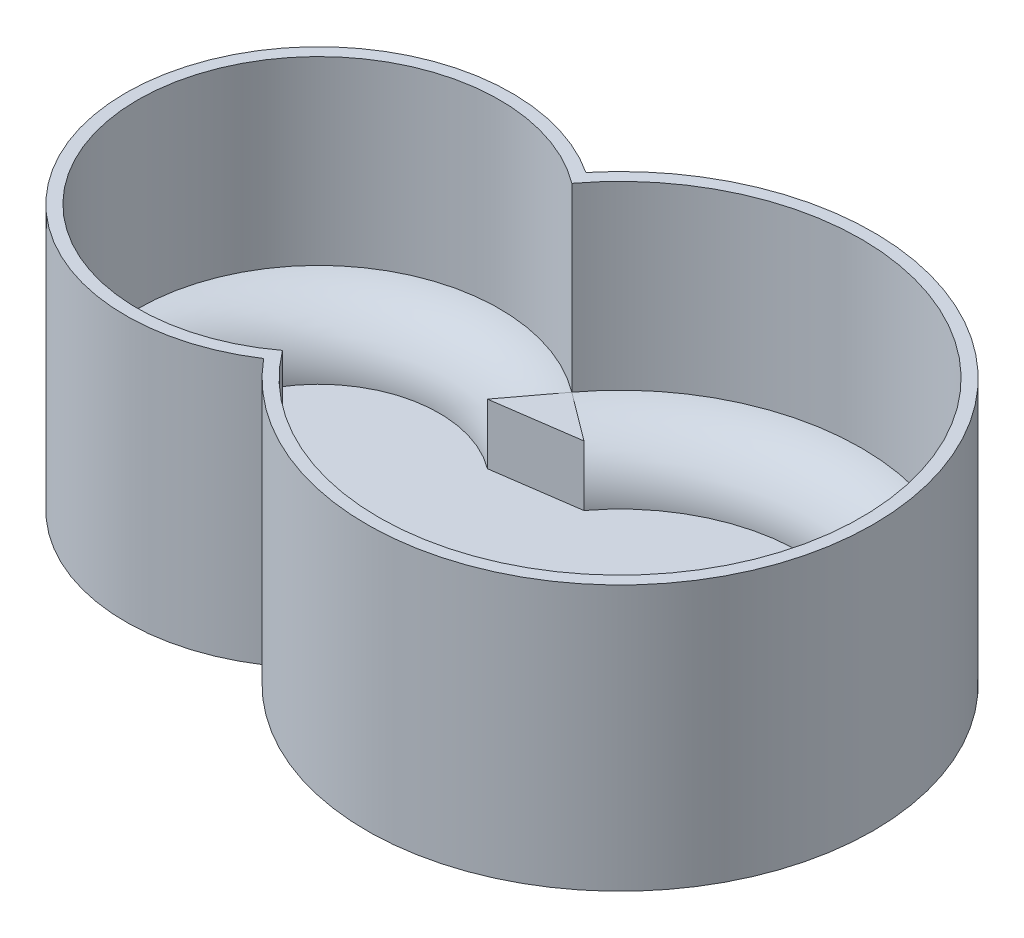
ISO-10303-21;
HEADER;
FILE_DESCRIPTION(('STEP AP214'),'2;1');
FILE_NAME('part.step','',(''),(''),'','','');
FILE_SCHEMA(('AUTOMOTIVE_DESIGN { 1 0 10303 214 1 1 1 1 }'));
ENDSEC;
DATA;
#1=APPLICATION_CONTEXT('core data for automotive mechanical design processes');
#2=APPLICATION_PROTOCOL_DEFINITION('international standard','automotive_design',2000,#1);
#3=PRODUCT_CONTEXT('',#1,'mechanical');
#4=PRODUCT('Part','Part','',(#3));
#5=PRODUCT_RELATED_PRODUCT_CATEGORY('part','',(#4));
#6=PRODUCT_DEFINITION_FORMATION('','',#4);
#7=PRODUCT_DEFINITION_CONTEXT('part definition',#1,'design');
#8=PRODUCT_DEFINITION('design','',#6,#7);
#9=PRODUCT_DEFINITION_SHAPE('','',#8);
#10=(LENGTH_UNIT() NAMED_UNIT(*) SI_UNIT(.MILLI.,.METRE.));
#11=(NAMED_UNIT(*) PLANE_ANGLE_UNIT() SI_UNIT($,.RADIAN.));
#12=(NAMED_UNIT(*) SI_UNIT($,.STERADIAN.) SOLID_ANGLE_UNIT());
#13=UNCERTAINTY_MEASURE_WITH_UNIT(LENGTH_MEASURE(1.E-05),#10,'distance_accuracy_value','');
#14=(GEOMETRIC_REPRESENTATION_CONTEXT(3) GLOBAL_UNCERTAINTY_ASSIGNED_CONTEXT((#13)) GLOBAL_UNIT_ASSIGNED_CONTEXT((#10,
#11,#12)) REPRESENTATION_CONTEXT('',''));
#15=CARTESIAN_POINT('',(0.,0.,0.));
#16=DIRECTION('',(0.,0.,1.));
#17=DIRECTION('',(1.,0.,0.));
#18=AXIS2_PLACEMENT_3D('',#15,#16,#17);
#19=CARTESIAN_POINT('',(-15.3320194768818,0.,-14.6396240059806));
#20=DIRECTION('',(0.,1.,0.));
#21=DIRECTION('',(0.,0.,1.));
#22=AXIS2_PLACEMENT_3D('',#19,#20,#21);
#23=PLANE('',#22);
#24=CARTESIAN_POINT('',(9.66798052311817,0.,-14.6396240059806));
#25=DIRECTION('',(0.,-1.,0.));
#26=DIRECTION('',(-0.8,0.,-0.6));
#27=AXIS2_PLACEMENT_3D('',#24,#25,#26);
#28=CIRCLE('',#27,15.);
#29=CARTESIAN_POINT('',(-2.33201947688185,0.,-23.6396240059806));
#30=VERTEX_POINT('',#29);
#31=CARTESIAN_POINT('',(-2.33201947688184,0.,-5.63962400598055));
#32=VERTEX_POINT('',#31);
#33=EDGE_CURVE('E165',#30,#32,#28,.T.);
#34=ORIENTED_EDGE('',*,*,#33,.F.);
#35=DIRECTION('',(0.989949493661166,0.,-0.141421356237311));
#36=VECTOR('',#35,1.);
#37=CARTESIAN_POINT('',(-2.33201947688185,0.,-23.6396240059806));
#38=LINE('',#37,#36);
#39=CARTESIAN_POINT('',(-9.33201947688184,0.,-22.6396240059806));
#40=VERTEX_POINT('',#39);
#41=EDGE_CURVE('E142',#40,#30,#38,.T.);
#42=ORIENTED_EDGE('',*,*,#41,.F.);
#43=CARTESIAN_POINT('',(-15.3320194768818,0.,-14.6396240059806));
#44=DIRECTION('',(0.,-1.,0.));
#45=DIRECTION('',(0.599999999999999,0.,0.800000000000001));
#46=AXIS2_PLACEMENT_3D('',#43,#44,#45);
#47=CIRCLE('',#46,10.);
#48=CARTESIAN_POINT('',(-9.33201947688185,0.,-6.63962400598055));
#49=VERTEX_POINT('',#48);
#50=EDGE_CURVE('E159',#49,#40,#47,.T.);
#51=ORIENTED_EDGE('',*,*,#50,.F.);
#52=DIRECTION('',(-0.989949493661166,0.,-0.14142135623731));
#53=VECTOR('',#52,1.);
#54=CARTESIAN_POINT('',(-9.33201947688185,0.,-6.63962400598055));
#55=LINE('',#54,#53);
#56=EDGE_CURVE('E133',#32,#49,#55,.T.);
#57=ORIENTED_EDGE('',*,*,#56,.F.);
#58=EDGE_LOOP('',(#34,#42,#51,#57));
#59=FACE_BOUND('',#58,.T.);
#60=ADVANCED_FACE('F45',(#59),#23,.T.);
#61=CARTESIAN_POINT('',(9.66798052311817,20.,-14.6396240059806));
#62=DIRECTION('',(0.,-1.,0.));
#63=DIRECTION('',(0.,0.,-1.));
#64=AXIS2_PLACEMENT_3D('',#61,#62,#63);
#65=CYLINDRICAL_SURFACE('',#64,20.);
#66=DIRECTION('',(0.,-1.,0.));
#67=VECTOR('',#66,1.);
#68=CARTESIAN_POINT('',(-6.33201947688185,20.,-26.6396240059806));
#69=LINE('',#68,#67);
#70=CARTESIAN_POINT('',(-6.33201947688185,20.,-26.6396240059806));
#71=VERTEX_POINT('',#70);
#72=CARTESIAN_POINT('',(-6.33201947688188,5.,-26.6396240059806));
#73=VERTEX_POINT('',#72);
#74=EDGE_CURVE('E12',#71,#73,#69,.T.);
#75=ORIENTED_EDGE('',*,*,#74,.T.);
#76=CARTESIAN_POINT('',(9.66798052311817,5.,-14.6396240059806));
#77=DIRECTION('',(0.,-1.,0.));
#78=DIRECTION('',(-0.8,0.,-0.6));
#79=AXIS2_PLACEMENT_3D('',#76,#77,#78);
#80=CIRCLE('',#79,20.0000000000001);
#81=CARTESIAN_POINT('',(-6.33201947688185,5.,-2.63962400598055));
#82=VERTEX_POINT('',#81);
#83=EDGE_CURVE('E170',#73,#82,#80,.T.);
#84=ORIENTED_EDGE('',*,*,#83,.T.);
#85=DIRECTION('',(0.,-1.,0.));
#86=VECTOR('',#85,1.);
#87=CARTESIAN_POINT('',(-6.33201947688185,20.,-2.63962400598055));
#88=LINE('',#87,#86);
#89=CARTESIAN_POINT('',(-6.33201947688185,20.,-2.63962400598055));
#90=VERTEX_POINT('',#89);
#91=EDGE_CURVE('E54',#90,#82,#88,.T.);
#92=ORIENTED_EDGE('',*,*,#91,.F.);
#93=CARTESIAN_POINT('',(9.66798052311817,20.,-14.6396240059806));
#94=DIRECTION('',(0.,1.,0.));
#95=DIRECTION('',(0.,0.,1.));
#96=AXIS2_PLACEMENT_3D('',#93,#94,#95);
#97=CIRCLE('',#96,20.);
#98=EDGE_CURVE('E187',#90,#71,#97,.T.);
#99=ORIENTED_EDGE('',*,*,#98,.T.);
#100=EDGE_LOOP('',(#75,#84,#92,#99));
#101=FACE_BOUND('',#100,.T.);
#102=ADVANCED_FACE('F216',(#101),#65,.F.);
#103=CARTESIAN_POINT('',(-15.3320194768818,20.,-14.6396240059806));
#104=DIRECTION('',(0.,-1.,0.));
#105=DIRECTION('',(0.,0.,-1.));
#106=AXIS2_PLACEMENT_3D('',#103,#104,#105);
#107=CYLINDRICAL_SURFACE('',#106,15.);
#108=CARTESIAN_POINT('',(-15.3320194768818,5.,-14.6396240059806));
#109=DIRECTION('',(0.,-1.,0.));
#110=DIRECTION('',(0.599999999999999,0.,0.800000000000001));
#111=AXIS2_PLACEMENT_3D('',#108,#109,#110);
#112=CIRCLE('',#111,15.);
#113=EDGE_CURVE('E157',#82,#73,#112,.T.);
#114=ORIENTED_EDGE('',*,*,#113,.T.);
#115=ORIENTED_EDGE('',*,*,#74,.F.);
#116=CARTESIAN_POINT('',(-15.3320194768818,20.,-14.6396240059806));
#117=DIRECTION('',(0.,1.,0.));
#118=DIRECTION('',(0.,0.,1.));
#119=AXIS2_PLACEMENT_3D('',#116,#117,#118);
#120=CIRCLE('',#119,15.);
#121=EDGE_CURVE('E184',#71,#90,#120,.T.);
#122=ORIENTED_EDGE('',*,*,#121,.T.);
#123=ORIENTED_EDGE('',*,*,#91,.T.);
#124=EDGE_LOOP('',(#114,#115,#122,#123));
#125=FACE_BOUND('',#124,.T.);
#126=ADVANCED_FACE('F221',(#125),#107,.F.);
#127=CARTESIAN_POINT('',(9.66798052311817,20.,-14.6396240059806));
#128=DIRECTION('',(0.,-1.,0.));
#129=DIRECTION('',(0.,0.,-1.));
#130=AXIS2_PLACEMENT_3D('',#127,#128,#129);
#131=CYLINDRICAL_SURFACE('',#130,21.);
#132=DIRECTION('',(0.,-1.,0.));
#133=VECTOR('',#132,1.);
#134=CARTESIAN_POINT('',(-6.53201947688184,20.,-1.2769895351885));
#135=LINE('',#134,#133);
#136=CARTESIAN_POINT('',(-6.53201947688184,20.,-1.2769895351885));
#137=VERTEX_POINT('',#136);
#138=CARTESIAN_POINT('',(-6.53201947688184,-2.,-1.2769895351885));
#139=VERTEX_POINT('',#138);
#140=EDGE_CURVE('E190',#137,#139,#135,.T.);
#141=ORIENTED_EDGE('',*,*,#140,.T.);
#142=CARTESIAN_POINT('',(9.66798052311817,-2.,-14.6396240059806));
#143=DIRECTION('',(0.,1.,0.));
#144=DIRECTION('',(0.,0.,1.));
#145=AXIS2_PLACEMENT_3D('',#142,#143,#144);
#146=CIRCLE('',#145,21.);
#147=CARTESIAN_POINT('',(-6.53201947688184,-2.,-28.0022584767726));
#148=VERTEX_POINT('',#147);
#149=EDGE_CURVE('E169',#139,#148,#146,.T.);
#150=ORIENTED_EDGE('',*,*,#149,.T.);
#151=DIRECTION('',(0.,-1.,0.));
#152=VECTOR('',#151,1.);
#153=CARTESIAN_POINT('',(-6.53201947688184,20.,-28.0022584767726));
#154=LINE('',#153,#152);
#155=CARTESIAN_POINT('',(-6.53201947688184,20.,-28.0022584767726));
#156=VERTEX_POINT('',#155);
#157=EDGE_CURVE('E49',#156,#148,#154,.T.);
#158=ORIENTED_EDGE('',*,*,#157,.F.);
#159=CARTESIAN_POINT('',(9.66798052311817,20.,-14.6396240059806));
#160=DIRECTION('',(0.,1.,0.));
#161=DIRECTION('',(0.,0.,1.));
#162=AXIS2_PLACEMENT_3D('',#159,#160,#161);
#163=CIRCLE('',#162,21.);
#164=EDGE_CURVE('E177',#137,#156,#163,.T.);
#165=ORIENTED_EDGE('',*,*,#164,.F.);
#166=EDGE_LOOP('',(#141,#150,#158,#165));
#167=FACE_BOUND('',#166,.T.);
#168=ADVANCED_FACE('F47',(#167),#131,.T.);
#169=CARTESIAN_POINT('',(-15.3320194768818,20.,-14.6396240059806));
#170=DIRECTION('',(0.,-1.,0.));
#171=DIRECTION('',(0.,0.,-1.));
#172=AXIS2_PLACEMENT_3D('',#169,#170,#171);
#173=CYLINDRICAL_SURFACE('',#172,16.);
#174=ORIENTED_EDGE('',*,*,#157,.T.);
#175=CARTESIAN_POINT('',(-15.3320194768818,-2.,-14.6396240059806));
#176=DIRECTION('',(0.,1.,0.));
#177=DIRECTION('',(0.,0.,1.));
#178=AXIS2_PLACEMENT_3D('',#175,#176,#177);
#179=CIRCLE('',#178,16.);
#180=EDGE_CURVE('E174',#148,#139,#179,.T.);
#181=ORIENTED_EDGE('',*,*,#180,.T.);
#182=ORIENTED_EDGE('',*,*,#140,.F.);
#183=CARTESIAN_POINT('',(-15.3320194768818,20.,-14.6396240059806));
#184=DIRECTION('',(0.,1.,0.));
#185=DIRECTION('',(0.,0.,1.));
#186=AXIS2_PLACEMENT_3D('',#183,#184,#185);
#187=CIRCLE('',#186,16.);
#188=EDGE_CURVE('E182',#156,#137,#187,.T.);
#189=ORIENTED_EDGE('',*,*,#188,.F.);
#190=EDGE_LOOP('',(#174,#181,#182,#189));
#191=FACE_BOUND('',#190,.T.);
#192=ADVANCED_FACE('F198',(#191),#173,.T.);
#193=CARTESIAN_POINT('',(0.,20.,0.));
#194=DIRECTION('',(0.,1.,0.));
#195=DIRECTION('',(0.,0.,1.));
#196=AXIS2_PLACEMENT_3D('',#193,#194,#195);
#197=PLANE('',#196);
#198=ORIENTED_EDGE('',*,*,#164,.T.);
#199=ORIENTED_EDGE('',*,*,#188,.T.);
#200=EDGE_LOOP('',(#198,#199));
#201=FACE_BOUND('',#200,.T.);
#202=ORIENTED_EDGE('',*,*,#121,.F.);
#203=ORIENTED_EDGE('',*,*,#98,.F.);
#204=EDGE_LOOP('',(#202,#203));
#205=FACE_BOUND('',#204,.T.);
#206=ADVANCED_FACE('F204',(#201,#205),#197,.T.);
#207=CARTESIAN_POINT('',(-15.3320194768818,-2.,-14.6396240059806));
#208=DIRECTION('',(0.,1.,0.));
#209=DIRECTION('',(0.,0.,1.));
#210=AXIS2_PLACEMENT_3D('',#207,#208,#209);
#211=PLANE('',#210);
#212=ORIENTED_EDGE('',*,*,#180,.F.);
#213=ORIENTED_EDGE('',*,*,#149,.F.);
#214=EDGE_LOOP('',(#212,#213));
#215=FACE_BOUND('',#214,.T.);
#216=ADVANCED_FACE('F201',(#215),#211,.F.);
#217=CARTESIAN_POINT('',(9.66798052311817,0.,-14.6396240059806));
#218=DIRECTION('',(0.,-1.,0.));
#219=DIRECTION('',(0.,0.,-1.));
#220=AXIS2_PLACEMENT_3D('',#217,#218,#219);
#221=TOROIDAL_SURFACE('',#220,20.,5.);
#222=ORIENTED_EDGE('',*,*,#83,.F.);
#223=CARTESIAN_POINT('',(-6.33201947688184,0.,-26.6396240059806));
#224=DIRECTION('',(-0.6,0.,0.8));
#225=DIRECTION('',(0.8,0.,0.6));
#226=AXIS2_PLACEMENT_3D('',#223,#224,#225);
#227=CIRCLE('',#226,5.);
#228=EDGE_CURVE('E70',#30,#73,#227,.T.);
#229=ORIENTED_EDGE('',*,*,#228,.F.);
#230=ORIENTED_EDGE('',*,*,#33,.T.);
#231=CARTESIAN_POINT('',(-6.33201947688185,0.,-2.63962400598055));
#232=DIRECTION('',(0.6,0.,0.8));
#233=DIRECTION('',(0.8,0.,-0.6));
#234=AXIS2_PLACEMENT_3D('',#231,#232,#233);
#235=CIRCLE('',#234,5.);
#236=EDGE_CURVE('E166',#32,#82,#235,.T.);
#237=ORIENTED_EDGE('',*,*,#236,.T.);
#238=EDGE_LOOP('',(#222,#229,#230,#237));
#239=FACE_BOUND('',#238,.T.);
#240=ADVANCED_FACE('F203',(#239),#221,.T.);
#241=CARTESIAN_POINT('',(-15.3320194768818,0.,-14.6396240059806));
#242=DIRECTION('',(0.,-1.,0.));
#243=DIRECTION('',(0.,0.,-1.));
#244=AXIS2_PLACEMENT_3D('',#241,#242,#243);
#245=TOROIDAL_SURFACE('',#244,15.,5.);
#246=ORIENTED_EDGE('',*,*,#50,.T.);
#247=CARTESIAN_POINT('',(-6.33201947688185,0.,-26.6396240059806));
#248=DIRECTION('',(0.800000000000001,0.,0.599999999999999));
#249=DIRECTION('',(-0.599999999999999,0.,0.800000000000001));
#250=AXIS2_PLACEMENT_3D('',#247,#248,#249);
#251=CIRCLE('',#250,5.);
#252=EDGE_CURVE('E130',#73,#40,#251,.T.);
#253=ORIENTED_EDGE('',*,*,#252,.F.);
#254=ORIENTED_EDGE('',*,*,#113,.F.);
#255=CARTESIAN_POINT('',(-6.33201947688185,0.,-2.63962400598055));
#256=DIRECTION('',(-0.800000000000001,0.,0.599999999999999));
#257=DIRECTION('',(-0.599999999999999,0.,-0.8));
#258=AXIS2_PLACEMENT_3D('',#255,#256,#257);
#259=CIRCLE('',#258,5.);
#260=EDGE_CURVE('E156',#82,#49,#259,.T.);
#261=ORIENTED_EDGE('',*,*,#260,.T.);
#262=EDGE_LOOP('',(#246,#253,#254,#261));
#263=FACE_BOUND('',#262,.T.);
#264=ADVANCED_FACE('F210',(#263),#245,.T.);
#265=CARTESIAN_POINT('',(-2.33201947688184,5.,-5.63962400598055));
#266=DIRECTION('',(-0.599999999999999,0.,-0.8));
#267=DIRECTION('',(-0.8,0.,0.599999999999999));
#268=AXIS2_PLACEMENT_3D('',#265,#266,#267);
#269=PLANE('',#268);
#270=DIRECTION('',(0.8,0.,-0.599999999999999));
#271=VECTOR('',#270,1.);
#272=CARTESIAN_POINT('',(-2.33201947688184,5.,-5.63962400598055));
#273=LINE('',#272,#271);
#274=CARTESIAN_POINT('',(-2.33201947688184,5.,-5.63962400598055));
#275=VERTEX_POINT('',#274);
#276=EDGE_CURVE('E147',#82,#275,#273,.T.);
#277=ORIENTED_EDGE('',*,*,#276,.F.);
#278=ORIENTED_EDGE('',*,*,#236,.F.);
#279=DIRECTION('',(0.,-1.,0.));
#280=VECTOR('',#279,1.);
#281=CARTESIAN_POINT('',(-2.33201947688184,5.,-5.63962400598055));
#282=LINE('',#281,#280);
#283=EDGE_CURVE('E153',#275,#32,#282,.T.);
#284=ORIENTED_EDGE('',*,*,#283,.F.);
#285=EDGE_LOOP('',(#277,#278,#284));
#286=FACE_BOUND('',#285,.T.);
#287=ADVANCED_FACE('F283',(#286),#269,.F.);
#288=CARTESIAN_POINT('',(-6.33201947688185,5.,-2.63962400598055));
#289=DIRECTION('',(0.8,0.,-0.599999999999999));
#290=DIRECTION('',(-0.599999999999999,0.,-0.8));
#291=AXIS2_PLACEMENT_3D('',#288,#289,#290);
#292=PLANE('',#291);
#293=ORIENTED_EDGE('',*,*,#260,.F.);
#294=DIRECTION('',(0.599999999999999,0.,0.8));
#295=VECTOR('',#294,1.);
#296=CARTESIAN_POINT('',(-6.33201947688185,5.,-2.63962400598055));
#297=LINE('',#296,#295);
#298=CARTESIAN_POINT('',(-9.33201947688185,5.,-6.63962400598055));
#299=VERTEX_POINT('',#298);
#300=EDGE_CURVE('E144',#299,#82,#297,.T.);
#301=ORIENTED_EDGE('',*,*,#300,.F.);
#302=DIRECTION('',(0.,-1.,0.));
#303=VECTOR('',#302,1.);
#304=CARTESIAN_POINT('',(-9.33201947688185,5.,-6.63962400598055));
#305=LINE('',#304,#303);
#306=EDGE_CURVE('E62',#299,#49,#305,.T.);
#307=ORIENTED_EDGE('',*,*,#306,.T.);
#308=EDGE_LOOP('',(#293,#301,#307));
#309=FACE_BOUND('',#308,.T.);
#310=ADVANCED_FACE('F273',(#309),#292,.F.);
#311=CARTESIAN_POINT('',(-9.33201947688185,5.,-6.63962400598055));
#312=DIRECTION('',(-0.14142135623731,0.,0.989949493661166));
#313=DIRECTION('',(0.989949493661166,0.,0.14142135623731));
#314=AXIS2_PLACEMENT_3D('',#311,#312,#313);
#315=PLANE('',#314);
#316=ORIENTED_EDGE('',*,*,#56,.T.);
#317=ORIENTED_EDGE('',*,*,#306,.F.);
#318=DIRECTION('',(-0.989949493661166,0.,-0.14142135623731));
#319=VECTOR('',#318,1.);
#320=CARTESIAN_POINT('',(-9.33201947688185,5.,-6.63962400598055));
#321=LINE('',#320,#319);
#322=EDGE_CURVE('E149',#275,#299,#321,.T.);
#323=ORIENTED_EDGE('',*,*,#322,.F.);
#324=ORIENTED_EDGE('',*,*,#283,.T.);
#325=EDGE_LOOP('',(#316,#317,#323,#324));
#326=FACE_BOUND('',#325,.T.);
#327=ADVANCED_FACE('F262',(#326),#315,.F.);
#328=CARTESIAN_POINT('',(0.,5.,0.));
#329=DIRECTION('',(0.,1.,0.));
#330=DIRECTION('',(0.,0.,1.));
#331=AXIS2_PLACEMENT_3D('',#328,#329,#330);
#332=PLANE('',#331);
#333=ORIENTED_EDGE('',*,*,#300,.T.);
#334=ORIENTED_EDGE('',*,*,#276,.T.);
#335=ORIENTED_EDGE('',*,*,#322,.T.);
#336=EDGE_LOOP('',(#333,#334,#335));
#337=FACE_BOUND('',#336,.T.);
#338=ADVANCED_FACE('F256',(#337),#332,.T.);
#339=CARTESIAN_POINT('',(-6.33201947688188,5.,-26.6396240059806));
#340=DIRECTION('',(-0.6,0.,0.8));
#341=DIRECTION('',(0.8,0.,0.6));
#342=AXIS2_PLACEMENT_3D('',#339,#340,#341);
#343=PLANE('',#342);
#344=DIRECTION('',(0.,-1.,0.));
#345=VECTOR('',#344,1.);
#346=CARTESIAN_POINT('',(-2.33201947688185,5.,-23.6396240059806));
#347=LINE('',#346,#345);
#348=CARTESIAN_POINT('',(-2.33201947688185,5.,-23.6396240059806));
#349=VERTEX_POINT('',#348);
#350=EDGE_CURVE('E134',#349,#30,#347,.T.);
#351=ORIENTED_EDGE('',*,*,#350,.T.);
#352=ORIENTED_EDGE('',*,*,#228,.T.);
#353=DIRECTION('',(-0.8,0.,-0.6));
#354=VECTOR('',#353,1.);
#355=CARTESIAN_POINT('',(-6.33201947688188,5.,-26.6396240059806));
#356=LINE('',#355,#354);
#357=EDGE_CURVE('E122',#349,#73,#356,.T.);
#358=ORIENTED_EDGE('',*,*,#357,.F.);
#359=EDGE_LOOP('',(#351,#352,#358));
#360=FACE_BOUND('',#359,.T.);
#361=ADVANCED_FACE('F261',(#360),#343,.F.);
#362=CARTESIAN_POINT('',(-9.33201947688184,5.,-22.6396240059806));
#363=DIRECTION('',(0.800000000000007,0.,0.599999999999991));
#364=DIRECTION('',(0.599999999999991,0.,-0.800000000000007));
#365=AXIS2_PLACEMENT_3D('',#362,#363,#364);
#366=PLANE('',#365);
#367=ORIENTED_EDGE('',*,*,#252,.T.);
#368=DIRECTION('',(0.,-1.,0.));
#369=VECTOR('',#368,1.);
#370=CARTESIAN_POINT('',(-9.33201947688184,5.,-22.6396240059806));
#371=LINE('',#370,#369);
#372=CARTESIAN_POINT('',(-9.33201947688184,5.,-22.6396240059806));
#373=VERTEX_POINT('',#372);
#374=EDGE_CURVE('E127',#373,#40,#371,.T.);
#375=ORIENTED_EDGE('',*,*,#374,.F.);
#376=DIRECTION('',(-0.599999999999991,0.,0.800000000000007));
#377=VECTOR('',#376,1.);
#378=CARTESIAN_POINT('',(-9.33201947688184,5.,-22.6396240059806));
#379=LINE('',#378,#377);
#380=EDGE_CURVE('E115',#73,#373,#379,.T.);
#381=ORIENTED_EDGE('',*,*,#380,.F.);
#382=EDGE_LOOP('',(#367,#375,#381));
#383=FACE_BOUND('',#382,.T.);
#384=ADVANCED_FACE('F128',(#383),#366,.F.);
#385=CARTESIAN_POINT('',(-2.33201947688185,5.,-23.6396240059806));
#386=DIRECTION('',(-0.141421356237311,0.,-0.989949493661166));
#387=DIRECTION('',(-0.989949493661166,0.,0.141421356237311));
#388=AXIS2_PLACEMENT_3D('',#385,#386,#387);
#389=PLANE('',#388);
#390=ORIENTED_EDGE('',*,*,#41,.T.);
#391=ORIENTED_EDGE('',*,*,#350,.F.);
#392=DIRECTION('',(0.989949493661166,0.,-0.141421356237311));
#393=VECTOR('',#392,1.);
#394=CARTESIAN_POINT('',(-2.33201947688185,5.,-23.6396240059806));
#395=LINE('',#394,#393);
#396=EDGE_CURVE('E119',#373,#349,#395,.T.);
#397=ORIENTED_EDGE('',*,*,#396,.F.);
#398=ORIENTED_EDGE('',*,*,#374,.T.);
#399=EDGE_LOOP('',(#390,#391,#397,#398));
#400=FACE_BOUND('',#399,.T.);
#401=ADVANCED_FACE('F136',(#400),#389,.F.);
#402=CARTESIAN_POINT('',(0.,5.,0.));
#403=DIRECTION('',(0.,1.,0.));
#404=DIRECTION('',(0.,0.,1.));
#405=AXIS2_PLACEMENT_3D('',#402,#403,#404);
#406=PLANE('',#405);
#407=ORIENTED_EDGE('',*,*,#357,.T.);
#408=ORIENTED_EDGE('',*,*,#380,.T.);
#409=ORIENTED_EDGE('',*,*,#396,.T.);
#410=EDGE_LOOP('',(#407,#408,#409));
#411=FACE_BOUND('',#410,.T.);
#412=ADVANCED_FACE('F117',(#411),#406,.T.);
#413=CLOSED_SHELL('',(#60,#102,#126,#168,#192,#206,#216,#240,#264,#287,#310,#327,#338,#361,#384,
#401,#412));
#414=MANIFOLD_SOLID_BREP('B2',#413);
#415=ADVANCED_BREP_SHAPE_REPRESENTATION('',(#18,#414),#14);
#416=SHAPE_DEFINITION_REPRESENTATION(#9,#415);
ENDSEC;
END-ISO-10303-21;
